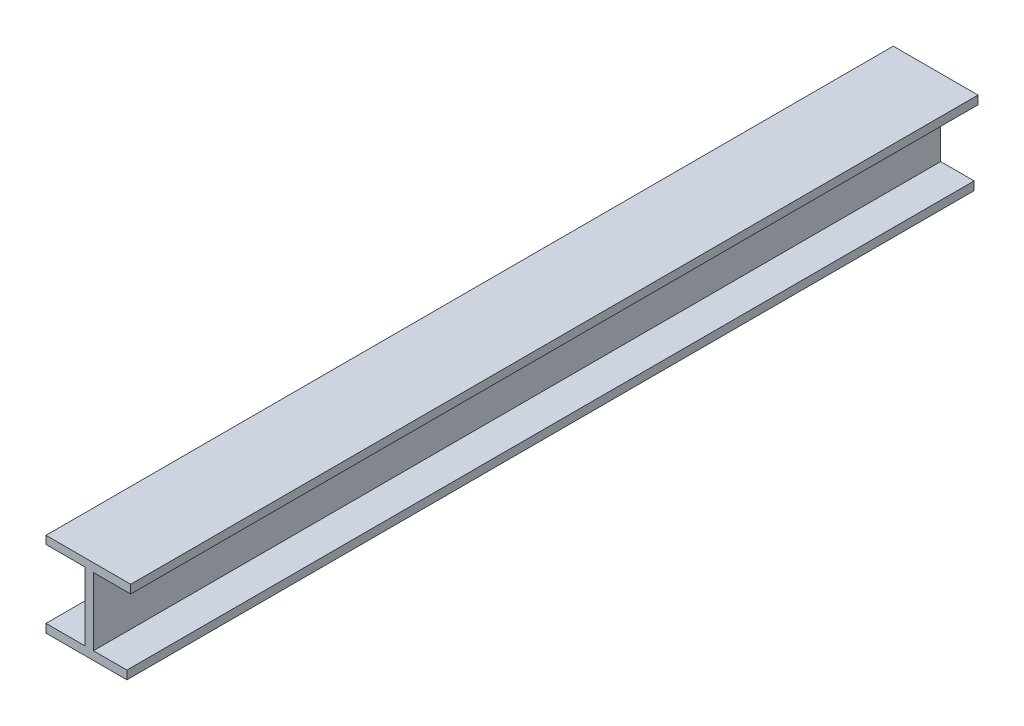
ISO-10303-21;
HEADER;
FILE_DESCRIPTION(('STEP AP214'),'2;1');
FILE_NAME('part.step','',(''),(''),'','','');
FILE_SCHEMA(('AUTOMOTIVE_DESIGN { 1 0 10303 214 1 1 1 1 }'));
ENDSEC;
DATA;
#1=APPLICATION_CONTEXT('core data for automotive mechanical design processes');
#2=APPLICATION_PROTOCOL_DEFINITION('international standard','automotive_design',2000,#1);
#3=PRODUCT_CONTEXT('',#1,'mechanical');
#4=PRODUCT('Part','Part','',(#3));
#5=PRODUCT_RELATED_PRODUCT_CATEGORY('part','',(#4));
#6=PRODUCT_DEFINITION_FORMATION('','',#4);
#7=PRODUCT_DEFINITION_CONTEXT('part definition',#1,'design');
#8=PRODUCT_DEFINITION('design','',#6,#7);
#9=PRODUCT_DEFINITION_SHAPE('','',#8);
#10=(LENGTH_UNIT() NAMED_UNIT(*) SI_UNIT(.MILLI.,.METRE.));
#11=(NAMED_UNIT(*) PLANE_ANGLE_UNIT() SI_UNIT($,.RADIAN.));
#12=(NAMED_UNIT(*) SI_UNIT($,.STERADIAN.) SOLID_ANGLE_UNIT());
#13=UNCERTAINTY_MEASURE_WITH_UNIT(LENGTH_MEASURE(1.E-05),#10,'distance_accuracy_value','');
#14=(GEOMETRIC_REPRESENTATION_CONTEXT(3) GLOBAL_UNCERTAINTY_ASSIGNED_CONTEXT((#13)) GLOBAL_UNIT_ASSIGNED_CONTEXT((#10,
#11,#12)) REPRESENTATION_CONTEXT('',''));
#15=CARTESIAN_POINT('',(0.,0.,0.));
#16=DIRECTION('',(0.,0.,1.));
#17=DIRECTION('',(1.,0.,0.));
#18=AXIS2_PLACEMENT_3D('',#15,#16,#17);
#19=CARTESIAN_POINT('',(54.0453074433657,67.4757281553398,1000.));
#20=DIRECTION('',(0.,-1.,0.));
#21=DIRECTION('',(1.,0.,0.));
#22=AXIS2_PLACEMENT_3D('',#19,#20,#21);
#23=PLANE('',#22);
#24=DIRECTION('',(-1.,0.,0.));
#25=VECTOR('',#24,1.);
#26=CARTESIAN_POINT('',(54.0453074433657,67.4757281553398,0.));
#27=LINE('',#26,#25);
#28=CARTESIAN_POINT('',(54.0453074433657,67.4757281553398,0.));
#29=VERTEX_POINT('',#28);
#30=CARTESIAN_POINT('',(-45.9546925566343,67.4757281553398,0.));
#31=VERTEX_POINT('',#30);
#32=EDGE_CURVE('E267',#29,#31,#27,.T.);
#33=ORIENTED_EDGE('',*,*,#32,.T.);
#34=DIRECTION('',(0.,0.,-1.));
#35=VECTOR('',#34,1.);
#36=CARTESIAN_POINT('',(-45.9546925566343,67.4757281553398,1000.));
#37=LINE('',#36,#35);
#38=CARTESIAN_POINT('',(-45.9546925566343,67.4757281553398,1000.));
#39=VERTEX_POINT('',#38);
#40=EDGE_CURVE('E12',#39,#31,#37,.T.);
#41=ORIENTED_EDGE('',*,*,#40,.F.);
#42=DIRECTION('',(-1.,0.,0.));
#43=VECTOR('',#42,1.);
#44=CARTESIAN_POINT('',(54.0453074433657,67.4757281553398,1000.));
#45=LINE('',#44,#43);
#46=CARTESIAN_POINT('',(54.0453074433657,67.4757281553398,1000.));
#47=VERTEX_POINT('',#46);
#48=EDGE_CURVE('E211',#47,#39,#45,.T.);
#49=ORIENTED_EDGE('',*,*,#48,.F.);
#50=DIRECTION('',(0.,0.,-1.));
#51=VECTOR('',#50,1.);
#52=CARTESIAN_POINT('',(54.0453074433657,67.4757281553398,1000.));
#53=LINE('',#52,#51);
#54=EDGE_CURVE('E195',#47,#29,#53,.T.);
#55=ORIENTED_EDGE('',*,*,#54,.T.);
#56=EDGE_LOOP('',(#33,#41,#49,#55));
#57=FACE_BOUND('',#56,.T.);
#58=ADVANCED_FACE('F48',(#57),#23,.F.);
#59=CARTESIAN_POINT('',(-45.9546925566343,67.4757281553398,1000.));
#60=DIRECTION('',(1.,0.,0.));
#61=DIRECTION('',(0.,0.,-1.));
#62=AXIS2_PLACEMENT_3D('',#59,#60,#61);
#63=PLANE('',#62);
#64=DIRECTION('',(0.,-1.,0.));
#65=VECTOR('',#64,1.);
#66=CARTESIAN_POINT('',(-45.9546925566343,67.4757281553398,0.));
#67=LINE('',#66,#65);
#68=CARTESIAN_POINT('',(-45.9546925566343,58.0906148867313,0.));
#69=VERTEX_POINT('',#68);
#70=EDGE_CURVE('E263',#31,#69,#67,.T.);
#71=ORIENTED_EDGE('',*,*,#70,.T.);
#72=DIRECTION('',(0.,0.,-1.));
#73=VECTOR('',#72,1.);
#74=CARTESIAN_POINT('',(-45.9546925566343,58.0906148867313,1000.));
#75=LINE('',#74,#73);
#76=CARTESIAN_POINT('',(-45.9546925566343,58.0906148867313,1000.));
#77=VERTEX_POINT('',#76);
#78=EDGE_CURVE('E59',#77,#69,#75,.T.);
#79=ORIENTED_EDGE('',*,*,#78,.F.);
#80=DIRECTION('',(0.,-1.,0.));
#81=VECTOR('',#80,1.);
#82=CARTESIAN_POINT('',(-45.9546925566343,67.4757281553398,1000.));
#83=LINE('',#82,#81);
#84=EDGE_CURVE('E140',#39,#77,#83,.T.);
#85=ORIENTED_EDGE('',*,*,#84,.F.);
#86=ORIENTED_EDGE('',*,*,#40,.T.);
#87=EDGE_LOOP('',(#71,#79,#85,#86));
#88=FACE_BOUND('',#87,.T.);
#89=ADVANCED_FACE('F395',(#88),#63,.F.);
#90=CARTESIAN_POINT('',(-45.9546925566343,58.0906148867313,1000.));
#91=DIRECTION('',(0.,1.,0.));
#92=DIRECTION('',(-1.,0.,0.));
#93=AXIS2_PLACEMENT_3D('',#90,#91,#92);
#94=PLANE('',#93);
#95=DIRECTION('',(1.,0.,0.));
#96=VECTOR('',#95,1.);
#97=CARTESIAN_POINT('',(-45.9546925566343,58.0906148867313,0.));
#98=LINE('',#97,#96);
#99=CARTESIAN_POINT('',(0.,58.0906148867313,0.));
#100=VERTEX_POINT('',#99);
#101=EDGE_CURVE('E266',#69,#100,#98,.T.);
#102=ORIENTED_EDGE('',*,*,#101,.T.);
#103=DIRECTION('',(0.,0.,-1.));
#104=VECTOR('',#103,1.);
#105=CARTESIAN_POINT('',(0.,58.0906148867313,1000.));
#106=LINE('',#105,#104);
#107=CARTESIAN_POINT('',(0.,58.0906148867313,1000.));
#108=VERTEX_POINT('',#107);
#109=EDGE_CURVE('E377',#108,#100,#106,.T.);
#110=ORIENTED_EDGE('',*,*,#109,.F.);
#111=DIRECTION('',(1.,0.,0.));
#112=VECTOR('',#111,1.);
#113=CARTESIAN_POINT('',(-45.9546925566343,58.0906148867313,1000.));
#114=LINE('',#113,#112);
#115=EDGE_CURVE('E218',#77,#108,#114,.T.);
#116=ORIENTED_EDGE('',*,*,#115,.F.);
#117=ORIENTED_EDGE('',*,*,#78,.T.);
#118=EDGE_LOOP('',(#102,#110,#116,#117));
#119=FACE_BOUND('',#118,.T.);
#120=ADVANCED_FACE('F386',(#119),#94,.F.);
#121=CARTESIAN_POINT('',(0.,58.0906148867313,1000.));
#122=DIRECTION('',(1.,0.,0.));
#123=DIRECTION('',(0.,1.,0.));
#124=AXIS2_PLACEMENT_3D('',#121,#122,#123);
#125=PLANE('',#124);
#126=DIRECTION('',(0.,-1.,0.));
#127=VECTOR('',#126,1.);
#128=CARTESIAN_POINT('',(0.,58.0906148867313,0.));
#129=LINE('',#128,#127);
#130=CARTESIAN_POINT('',(0.,-22.5242718446602,0.));
#131=VERTEX_POINT('',#130);
#132=EDGE_CURVE('E272',#100,#131,#129,.T.);
#133=ORIENTED_EDGE('',*,*,#132,.T.);
#134=DIRECTION('',(0.,0.,-1.));
#135=VECTOR('',#134,1.);
#136=CARTESIAN_POINT('',(0.,-22.5242718446602,1000.));
#137=LINE('',#136,#135);
#138=CARTESIAN_POINT('',(0.,-22.5242718446602,1000.));
#139=VERTEX_POINT('',#138);
#140=EDGE_CURVE('E360',#139,#131,#137,.T.);
#141=ORIENTED_EDGE('',*,*,#140,.F.);
#142=DIRECTION('',(0.,-1.,0.));
#143=VECTOR('',#142,1.);
#144=CARTESIAN_POINT('',(0.,58.0906148867313,1000.));
#145=LINE('',#144,#143);
#146=EDGE_CURVE('E324',#108,#139,#145,.T.);
#147=ORIENTED_EDGE('',*,*,#146,.F.);
#148=ORIENTED_EDGE('',*,*,#109,.T.);
#149=EDGE_LOOP('',(#133,#141,#147,#148));
#150=FACE_BOUND('',#149,.T.);
#151=ADVANCED_FACE('F390',(#150),#125,.F.);
#152=CARTESIAN_POINT('',(0.,-22.5242718446602,1000.));
#153=DIRECTION('',(0.,-1.,0.));
#154=DIRECTION('',(1.,0.,0.));
#155=AXIS2_PLACEMENT_3D('',#152,#153,#154);
#156=PLANE('',#155);
#157=DIRECTION('',(-1.,0.,0.));
#158=VECTOR('',#157,1.);
#159=CARTESIAN_POINT('',(0.,-22.5242718446602,0.));
#160=LINE('',#159,#158);
#161=CARTESIAN_POINT('',(-45.9546925566343,-22.5242718446602,0.));
#162=VERTEX_POINT('',#161);
#163=EDGE_CURVE('E275',#131,#162,#160,.T.);
#164=ORIENTED_EDGE('',*,*,#163,.T.);
#165=DIRECTION('',(0.,0.,-1.));
#166=VECTOR('',#165,1.);
#167=CARTESIAN_POINT('',(-45.9546925566343,-22.5242718446602,1000.));
#168=LINE('',#167,#166);
#169=CARTESIAN_POINT('',(-45.9546925566343,-22.5242718446602,1000.));
#170=VERTEX_POINT('',#169);
#171=EDGE_CURVE('E357',#170,#162,#168,.T.);
#172=ORIENTED_EDGE('',*,*,#171,.F.);
#173=DIRECTION('',(-1.,0.,0.));
#174=VECTOR('',#173,1.);
#175=CARTESIAN_POINT('',(0.,-22.5242718446602,1000.));
#176=LINE('',#175,#174);
#177=EDGE_CURVE('E326',#139,#170,#176,.T.);
#178=ORIENTED_EDGE('',*,*,#177,.F.);
#179=ORIENTED_EDGE('',*,*,#140,.T.);
#180=EDGE_LOOP('',(#164,#172,#178,#179));
#181=FACE_BOUND('',#180,.T.);
#182=ADVANCED_FACE('F394',(#181),#156,.F.);
#183=CARTESIAN_POINT('',(-45.9546925566343,-22.5242718446602,1000.));
#184=DIRECTION('',(1.,0.,0.));
#185=DIRECTION('',(0.,1.,0.));
#186=AXIS2_PLACEMENT_3D('',#183,#184,#185);
#187=PLANE('',#186);
#188=DIRECTION('',(0.,-1.,0.));
#189=VECTOR('',#188,1.);
#190=CARTESIAN_POINT('',(-45.9546925566343,-22.5242718446602,0.));
#191=LINE('',#190,#189);
#192=CARTESIAN_POINT('',(-45.9546925566343,-32.5242718446602,0.));
#193=VERTEX_POINT('',#192);
#194=EDGE_CURVE('E232',#162,#193,#191,.T.);
#195=ORIENTED_EDGE('',*,*,#194,.T.);
#196=DIRECTION('',(0.,0.,-1.));
#197=VECTOR('',#196,1.);
#198=CARTESIAN_POINT('',(-45.9546925566343,-32.5242718446602,1000.));
#199=LINE('',#198,#197);
#200=CARTESIAN_POINT('',(-45.9546925566343,-32.5242718446602,1000.));
#201=VERTEX_POINT('',#200);
#202=EDGE_CURVE('E345',#201,#193,#199,.T.);
#203=ORIENTED_EDGE('',*,*,#202,.F.);
#204=DIRECTION('',(0.,-1.,0.));
#205=VECTOR('',#204,1.);
#206=CARTESIAN_POINT('',(-45.9546925566343,-22.5242718446602,1000.));
#207=LINE('',#206,#205);
#208=EDGE_CURVE('E328',#170,#201,#207,.T.);
#209=ORIENTED_EDGE('',*,*,#208,.F.);
#210=ORIENTED_EDGE('',*,*,#171,.T.);
#211=EDGE_LOOP('',(#195,#203,#209,#210));
#212=FACE_BOUND('',#211,.T.);
#213=ADVANCED_FACE('F355',(#212),#187,.F.);
#214=CARTESIAN_POINT('',(-45.9546925566343,-32.5242718446602,1000.));
#215=DIRECTION('',(0.,1.,0.));
#216=DIRECTION('',(0.,0.,1.));
#217=AXIS2_PLACEMENT_3D('',#214,#215,#216);
#218=PLANE('',#217);
#219=DIRECTION('',(1.,0.,0.));
#220=VECTOR('',#219,1.);
#221=CARTESIAN_POINT('',(-45.9546925566343,-32.5242718446602,0.));
#222=LINE('',#221,#220);
#223=CARTESIAN_POINT('',(49.5145631067961,-32.5242718446602,0.));
#224=VERTEX_POINT('',#223);
#225=EDGE_CURVE('E226',#193,#224,#222,.T.);
#226=ORIENTED_EDGE('',*,*,#225,.T.);
#227=DIRECTION('',(0.,0.,-1.));
#228=VECTOR('',#227,1.);
#229=CARTESIAN_POINT('',(49.5145631067961,-32.5242718446602,1000.));
#230=LINE('',#229,#228);
#231=CARTESIAN_POINT('',(49.5145631067961,-32.5242718446602,1000.));
#232=VERTEX_POINT('',#231);
#233=EDGE_CURVE('E294',#232,#224,#230,.T.);
#234=ORIENTED_EDGE('',*,*,#233,.F.);
#235=DIRECTION('',(1.,0.,0.));
#236=VECTOR('',#235,1.);
#237=CARTESIAN_POINT('',(-45.9546925566343,-32.5242718446602,1000.));
#238=LINE('',#237,#236);
#239=EDGE_CURVE('E250',#201,#232,#238,.T.);
#240=ORIENTED_EDGE('',*,*,#239,.F.);
#241=ORIENTED_EDGE('',*,*,#202,.T.);
#242=EDGE_LOOP('',(#226,#234,#240,#241));
#243=FACE_BOUND('',#242,.T.);
#244=ADVANCED_FACE('F340',(#243),#218,.F.);
#245=CARTESIAN_POINT('',(49.5145631067961,-32.5242718446602,1000.));
#246=DIRECTION('',(-1.,0.,0.));
#247=DIRECTION('',(0.,0.,1.));
#248=AXIS2_PLACEMENT_3D('',#245,#246,#247);
#249=PLANE('',#248);
#250=DIRECTION('',(0.,1.,0.));
#251=VECTOR('',#250,1.);
#252=CARTESIAN_POINT('',(49.5145631067961,-32.5242718446602,0.));
#253=LINE('',#252,#251);
#254=CARTESIAN_POINT('',(49.5145631067961,-22.5242718446602,0.));
#255=VERTEX_POINT('',#254);
#256=EDGE_CURVE('E231',#224,#255,#253,.T.);
#257=ORIENTED_EDGE('',*,*,#256,.T.);
#258=DIRECTION('',(0.,0.,-1.));
#259=VECTOR('',#258,1.);
#260=CARTESIAN_POINT('',(49.5145631067961,-22.5242718446602,1000.));
#261=LINE('',#260,#259);
#262=CARTESIAN_POINT('',(49.5145631067961,-22.5242718446602,1000.));
#263=VERTEX_POINT('',#262);
#264=EDGE_CURVE('E289',#263,#255,#261,.T.);
#265=ORIENTED_EDGE('',*,*,#264,.F.);
#266=DIRECTION('',(0.,1.,0.));
#267=VECTOR('',#266,1.);
#268=CARTESIAN_POINT('',(49.5145631067961,-32.5242718446602,1000.));
#269=LINE('',#268,#267);
#270=EDGE_CURVE('E246',#232,#263,#269,.T.);
#271=ORIENTED_EDGE('',*,*,#270,.F.);
#272=ORIENTED_EDGE('',*,*,#233,.T.);
#273=EDGE_LOOP('',(#257,#265,#271,#272));
#274=FACE_BOUND('',#273,.T.);
#275=ADVANCED_FACE('F346',(#274),#249,.F.);
#276=CARTESIAN_POINT('',(49.5145631067961,-22.5242718446602,1000.));
#277=DIRECTION('',(0.,-1.,0.));
#278=DIRECTION('',(1.,0.,0.));
#279=AXIS2_PLACEMENT_3D('',#276,#277,#278);
#280=PLANE('',#279);
#281=DIRECTION('',(-1.,0.,0.));
#282=VECTOR('',#281,1.);
#283=CARTESIAN_POINT('',(49.5145631067961,-22.5242718446602,0.));
#284=LINE('',#283,#282);
#285=CARTESIAN_POINT('',(10.,-22.5242718446602,0.));
#286=VERTEX_POINT('',#285);
#287=EDGE_CURVE('E238',#255,#286,#284,.T.);
#288=ORIENTED_EDGE('',*,*,#287,.T.);
#289=DIRECTION('',(0.,0.,-1.));
#290=VECTOR('',#289,1.);
#291=CARTESIAN_POINT('',(10.,-22.5242718446602,1000.));
#292=LINE('',#291,#290);
#293=CARTESIAN_POINT('',(10.,-22.5242718446602,1000.));
#294=VERTEX_POINT('',#293);
#295=EDGE_CURVE('E188',#294,#286,#292,.T.);
#296=ORIENTED_EDGE('',*,*,#295,.F.);
#297=DIRECTION('',(-1.,0.,0.));
#298=VECTOR('',#297,1.);
#299=CARTESIAN_POINT('',(49.5145631067961,-22.5242718446602,1000.));
#300=LINE('',#299,#298);
#301=EDGE_CURVE('E177',#263,#294,#300,.T.);
#302=ORIENTED_EDGE('',*,*,#301,.F.);
#303=ORIENTED_EDGE('',*,*,#264,.T.);
#304=EDGE_LOOP('',(#288,#296,#302,#303));
#305=FACE_BOUND('',#304,.T.);
#306=ADVANCED_FACE('F349',(#305),#280,.F.);
#307=CARTESIAN_POINT('',(10.,-22.5242718446602,1000.));
#308=DIRECTION('',(-1.,0.,0.));
#309=DIRECTION('',(0.,-1.,0.));
#310=AXIS2_PLACEMENT_3D('',#307,#308,#309);
#311=PLANE('',#310);
#312=DIRECTION('',(0.,1.,0.));
#313=VECTOR('',#312,1.);
#314=CARTESIAN_POINT('',(10.,-22.5242718446602,0.));
#315=LINE('',#314,#313);
#316=CARTESIAN_POINT('',(10.,57.4757281553398,0.));
#317=VERTEX_POINT('',#316);
#318=EDGE_CURVE('E186',#286,#317,#315,.T.);
#319=ORIENTED_EDGE('',*,*,#318,.T.);
#320=DIRECTION('',(0.,0.,-1.));
#321=VECTOR('',#320,1.);
#322=CARTESIAN_POINT('',(10.,57.4757281553398,1000.));
#323=LINE('',#322,#321);
#324=CARTESIAN_POINT('',(10.,57.4757281553398,1000.));
#325=VERTEX_POINT('',#324);
#326=EDGE_CURVE('E183',#325,#317,#323,.T.);
#327=ORIENTED_EDGE('',*,*,#326,.F.);
#328=DIRECTION('',(0.,1.,0.));
#329=VECTOR('',#328,1.);
#330=CARTESIAN_POINT('',(10.,-22.5242718446602,1000.));
#331=LINE('',#330,#329);
#332=EDGE_CURVE('E171',#294,#325,#331,.T.);
#333=ORIENTED_EDGE('',*,*,#332,.F.);
#334=ORIENTED_EDGE('',*,*,#295,.T.);
#335=EDGE_LOOP('',(#319,#327,#333,#334));
#336=FACE_BOUND('',#335,.T.);
#337=ADVANCED_FACE('F184',(#336),#311,.F.);
#338=CARTESIAN_POINT('',(10.,57.4757281553398,1000.));
#339=DIRECTION('',(0.,1.,0.));
#340=DIRECTION('',(0.,0.,1.));
#341=AXIS2_PLACEMENT_3D('',#338,#339,#340);
#342=PLANE('',#341);
#343=DIRECTION('',(1.,0.,0.));
#344=VECTOR('',#343,1.);
#345=CARTESIAN_POINT('',(10.,57.4757281553398,0.));
#346=LINE('',#345,#344);
#347=CARTESIAN_POINT('',(54.0453074433657,57.4757281553398,0.));
#348=VERTEX_POINT('',#347);
#349=EDGE_CURVE('E123',#317,#348,#346,.T.);
#350=ORIENTED_EDGE('',*,*,#349,.T.);
#351=DIRECTION('',(0.,0.,-1.));
#352=VECTOR('',#351,1.);
#353=CARTESIAN_POINT('',(54.0453074433657,57.4757281553398,1000.));
#354=LINE('',#353,#352);
#355=CARTESIAN_POINT('',(54.0453074433657,57.4757281553398,1000.));
#356=VERTEX_POINT('',#355);
#357=EDGE_CURVE('E189',#356,#348,#354,.T.);
#358=ORIENTED_EDGE('',*,*,#357,.F.);
#359=DIRECTION('',(1.,0.,0.));
#360=VECTOR('',#359,1.);
#361=CARTESIAN_POINT('',(10.,57.4757281553398,1000.));
#362=LINE('',#361,#360);
#363=EDGE_CURVE('E175',#325,#356,#362,.T.);
#364=ORIENTED_EDGE('',*,*,#363,.F.);
#365=ORIENTED_EDGE('',*,*,#326,.T.);
#366=EDGE_LOOP('',(#350,#358,#364,#365));
#367=FACE_BOUND('',#366,.T.);
#368=ADVANCED_FACE('F191',(#367),#342,.F.);
#369=CARTESIAN_POINT('',(54.0453074433657,57.4757281553398,1000.));
#370=DIRECTION('',(-1.,0.,0.));
#371=DIRECTION('',(0.,0.,1.));
#372=AXIS2_PLACEMENT_3D('',#369,#370,#371);
#373=PLANE('',#372);
#374=DIRECTION('',(0.,1.,0.));
#375=VECTOR('',#374,1.);
#376=CARTESIAN_POINT('',(54.0453074433657,57.4757281553398,0.));
#377=LINE('',#376,#375);
#378=EDGE_CURVE('E130',#348,#29,#377,.T.);
#379=ORIENTED_EDGE('',*,*,#378,.T.);
#380=ORIENTED_EDGE('',*,*,#54,.F.);
#381=DIRECTION('',(0.,1.,0.));
#382=VECTOR('',#381,1.);
#383=CARTESIAN_POINT('',(54.0453074433657,57.4757281553398,1000.));
#384=LINE('',#383,#382);
#385=EDGE_CURVE('E70',#356,#47,#384,.T.);
#386=ORIENTED_EDGE('',*,*,#385,.F.);
#387=ORIENTED_EDGE('',*,*,#357,.T.);
#388=EDGE_LOOP('',(#379,#380,#386,#387));
#389=FACE_BOUND('',#388,.T.);
#390=ADVANCED_FACE('F311',(#389),#373,.F.);
#391=CARTESIAN_POINT('',(0.,0.,1000.));
#392=DIRECTION('',(0.,0.,1.));
#393=DIRECTION('',(1.,0.,0.));
#394=AXIS2_PLACEMENT_3D('',#391,#392,#393);
#395=PLANE('',#394);
#396=ORIENTED_EDGE('',*,*,#48,.T.);
#397=ORIENTED_EDGE('',*,*,#84,.T.);
#398=ORIENTED_EDGE('',*,*,#115,.T.);
#399=ORIENTED_EDGE('',*,*,#146,.T.);
#400=ORIENTED_EDGE('',*,*,#177,.T.);
#401=ORIENTED_EDGE('',*,*,#208,.T.);
#402=ORIENTED_EDGE('',*,*,#239,.T.);
#403=ORIENTED_EDGE('',*,*,#270,.T.);
#404=ORIENTED_EDGE('',*,*,#301,.T.);
#405=ORIENTED_EDGE('',*,*,#332,.T.);
#406=ORIENTED_EDGE('',*,*,#363,.T.);
#407=ORIENTED_EDGE('',*,*,#385,.T.);
#408=EDGE_LOOP('',(#396,#397,#398,#399,#400,#401,#402,#403,#404,#405,#406,#407));
#409=FACE_BOUND('',#408,.T.);
#410=ADVANCED_FACE('F173',(#409),#395,.T.);
#411=CARTESIAN_POINT('',(0.,0.,0.));
#412=DIRECTION('',(0.,0.,1.));
#413=DIRECTION('',(1.,0.,0.));
#414=AXIS2_PLACEMENT_3D('',#411,#412,#413);
#415=PLANE('',#414);
#416=ORIENTED_EDGE('',*,*,#32,.F.);
#417=ORIENTED_EDGE('',*,*,#378,.F.);
#418=ORIENTED_EDGE('',*,*,#349,.F.);
#419=ORIENTED_EDGE('',*,*,#318,.F.);
#420=ORIENTED_EDGE('',*,*,#287,.F.);
#421=ORIENTED_EDGE('',*,*,#256,.F.);
#422=ORIENTED_EDGE('',*,*,#225,.F.);
#423=ORIENTED_EDGE('',*,*,#194,.F.);
#424=ORIENTED_EDGE('',*,*,#163,.F.);
#425=ORIENTED_EDGE('',*,*,#132,.F.);
#426=ORIENTED_EDGE('',*,*,#101,.F.);
#427=ORIENTED_EDGE('',*,*,#70,.F.);
#428=EDGE_LOOP('',(#416,#417,#418,#419,#420,#421,#422,#423,#424,#425,#426,#427));
#429=FACE_BOUND('',#428,.T.);
#430=ADVANCED_FACE('F313',(#429),#415,.F.);
#431=CLOSED_SHELL('',(#58,#89,#120,#151,#182,#213,#244,#275,#306,#337,#368,#390,#410,#430));
#432=MANIFOLD_SOLID_BREP('B2',#431);
#433=ADVANCED_BREP_SHAPE_REPRESENTATION('',(#18,#432),#14);
#434=SHAPE_DEFINITION_REPRESENTATION(#9,#433);
ENDSEC;
END-ISO-10303-21;
